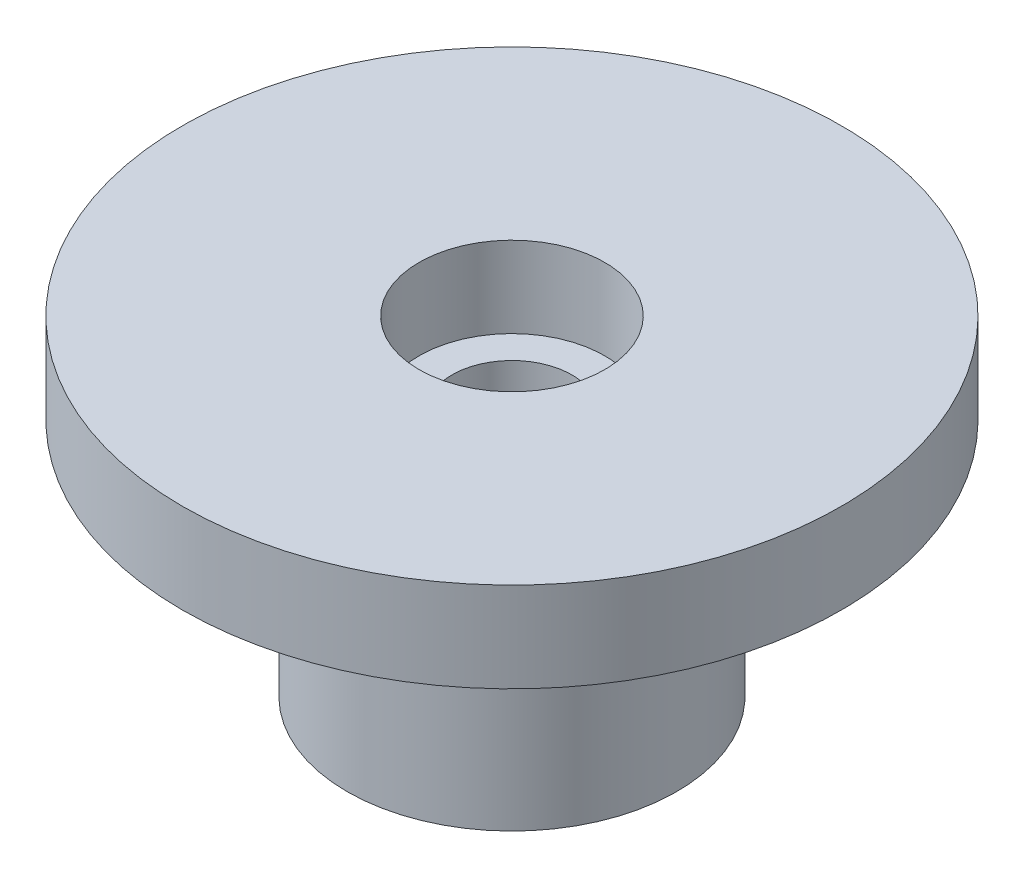
ISO-10303-21;
HEADER;
FILE_DESCRIPTION(('STEP AP214'),'2;1');
FILE_NAME('part.step','',(''),(''),'','','');
FILE_SCHEMA(('AUTOMOTIVE_DESIGN { 1 0 10303 214 1 1 1 1 }'));
ENDSEC;
DATA;
#1=APPLICATION_CONTEXT('core data for automotive mechanical design processes');
#2=APPLICATION_PROTOCOL_DEFINITION('international standard','automotive_design',2000,#1);
#3=PRODUCT_CONTEXT('',#1,'mechanical');
#4=PRODUCT('Part','Part','',(#3));
#5=PRODUCT_RELATED_PRODUCT_CATEGORY('part','',(#4));
#6=PRODUCT_DEFINITION_FORMATION('','',#4);
#7=PRODUCT_DEFINITION_CONTEXT('part definition',#1,'design');
#8=PRODUCT_DEFINITION('design','',#6,#7);
#9=PRODUCT_DEFINITION_SHAPE('','',#8);
#10=(LENGTH_UNIT() NAMED_UNIT(*) SI_UNIT(.MILLI.,.METRE.));
#11=(NAMED_UNIT(*) PLANE_ANGLE_UNIT() SI_UNIT($,.RADIAN.));
#12=(NAMED_UNIT(*) SI_UNIT($,.STERADIAN.) SOLID_ANGLE_UNIT());
#13=UNCERTAINTY_MEASURE_WITH_UNIT(LENGTH_MEASURE(1.E-05),#10,'distance_accuracy_value','');
#14=(GEOMETRIC_REPRESENTATION_CONTEXT(3) GLOBAL_UNCERTAINTY_ASSIGNED_CONTEXT((#13)) GLOBAL_UNIT_ASSIGNED_CONTEXT((#10,
#11,#12)) REPRESENTATION_CONTEXT('',''));
#15=CARTESIAN_POINT('',(0.,0.,0.));
#16=DIRECTION('',(0.,0.,1.));
#17=DIRECTION('',(1.,0.,0.));
#18=AXIS2_PLACEMENT_3D('',#15,#16,#17);
#19=CARTESIAN_POINT('',(0.,-11.,0.));
#20=DIRECTION('',(0.,1.,0.));
#21=DIRECTION('',(0.,0.,1.));
#22=AXIS2_PLACEMENT_3D('',#19,#20,#21);
#23=CYLINDRICAL_SURFACE('',#22,2.);
#24=CARTESIAN_POINT('',(0.,0.,0.));
#25=DIRECTION('',(0.,1.,0.));
#26=DIRECTION('',(0.,0.,1.));
#27=AXIS2_PLACEMENT_3D('',#24,#25,#26);
#28=CIRCLE('',#27,2.);
#29=CARTESIAN_POINT('',(0.,0.,2.));
#30=VERTEX_POINT('',#29);
#31=EDGE_CURVE('E63',#30,#30,#28,.F.);
#32=ORIENTED_EDGE('',*,*,#31,.T.);
#33=EDGE_LOOP('',(#32));
#34=FACE_BOUND('',#33,.T.);
#35=CARTESIAN_POINT('',(0.,8.3,0.));
#36=DIRECTION('',(0.,1.,0.));
#37=DIRECTION('',(0.,0.,1.));
#38=AXIS2_PLACEMENT_3D('',#35,#36,#37);
#39=CIRCLE('',#38,2.);
#40=CARTESIAN_POINT('',(0.,8.3,2.));
#41=VERTEX_POINT('',#40);
#42=EDGE_CURVE('E51',#41,#41,#39,.F.);
#43=ORIENTED_EDGE('',*,*,#42,.F.);
#44=EDGE_LOOP('',(#43));
#45=FACE_BOUND('',#44,.T.);
#46=ADVANCED_FACE('F35',(#34,#45),#23,.F.);
#47=CARTESIAN_POINT('',(0.,11.,0.));
#48=DIRECTION('',(0.,-1.,0.));
#49=DIRECTION('',(0.,0.,-1.));
#50=AXIS2_PLACEMENT_3D('',#47,#48,#49);
#51=CYLINDRICAL_SURFACE('',#50,11.);
#52=CARTESIAN_POINT('',(0.,8.,0.));
#53=DIRECTION('',(0.,1.,0.));
#54=DIRECTION('',(0.,0.,1.));
#55=AXIS2_PLACEMENT_3D('',#52,#53,#54);
#56=CIRCLE('',#55,11.);
#57=CARTESIAN_POINT('',(0.,8.,11.));
#58=VERTEX_POINT('',#57);
#59=EDGE_CURVE('E43',#58,#58,#56,.T.);
#60=ORIENTED_EDGE('',*,*,#59,.T.);
#61=EDGE_LOOP('',(#60));
#62=FACE_BOUND('',#61,.T.);
#63=CARTESIAN_POINT('',(0.,11.,0.));
#64=DIRECTION('',(0.,1.,0.));
#65=DIRECTION('',(0.,0.,1.));
#66=AXIS2_PLACEMENT_3D('',#63,#64,#65);
#67=CIRCLE('',#66,11.);
#68=CARTESIAN_POINT('',(0.,11.,11.));
#69=VERTEX_POINT('',#68);
#70=EDGE_CURVE('E10',#69,#69,#67,.T.);
#71=ORIENTED_EDGE('',*,*,#70,.F.);
#72=EDGE_LOOP('',(#71));
#73=FACE_BOUND('',#72,.T.);
#74=ADVANCED_FACE('F37',(#62,#73),#51,.T.);
#75=CARTESIAN_POINT('',(0.,11.,0.));
#76=DIRECTION('',(0.,1.,0.));
#77=DIRECTION('',(0.,0.,1.));
#78=AXIS2_PLACEMENT_3D('',#75,#76,#77);
#79=PLANE('',#78);
#80=CARTESIAN_POINT('',(0.,11.,0.));
#81=DIRECTION('',(0.,1.,0.));
#82=DIRECTION('',(0.,0.,1.));
#83=AXIS2_PLACEMENT_3D('',#80,#81,#82);
#84=CIRCLE('',#83,3.1);
#85=CARTESIAN_POINT('',(0.,11.,3.1));
#86=VERTEX_POINT('',#85);
#87=EDGE_CURVE('E58',#86,#86,#84,.T.);
#88=ORIENTED_EDGE('',*,*,#87,.F.);
#89=EDGE_LOOP('',(#88));
#90=FACE_BOUND('',#89,.T.);
#91=ORIENTED_EDGE('',*,*,#70,.T.);
#92=EDGE_LOOP('',(#91));
#93=FACE_BOUND('',#92,.T.);
#94=ADVANCED_FACE('F92',(#90,#93),#79,.T.);
#95=CARTESIAN_POINT('',(0.,8.,0.));
#96=DIRECTION('',(0.,1.,0.));
#97=DIRECTION('',(0.,0.,1.));
#98=AXIS2_PLACEMENT_3D('',#95,#96,#97);
#99=PLANE('',#98);
#100=ORIENTED_EDGE('',*,*,#59,.F.);
#101=EDGE_LOOP('',(#100));
#102=FACE_BOUND('',#101,.T.);
#103=CARTESIAN_POINT('',(0.,8.,0.));
#104=DIRECTION('',(0.,1.,0.));
#105=DIRECTION('',(0.,0.,1.));
#106=AXIS2_PLACEMENT_3D('',#103,#104,#105);
#107=CIRCLE('',#106,5.5);
#108=CARTESIAN_POINT('',(0.,8.,5.5));
#109=VERTEX_POINT('',#108);
#110=EDGE_CURVE('E48',#109,#109,#107,.T.);
#111=ORIENTED_EDGE('',*,*,#110,.T.);
#112=EDGE_LOOP('',(#111));
#113=FACE_BOUND('',#112,.T.);
#114=ADVANCED_FACE('F98',(#102,#113),#99,.F.);
#115=CARTESIAN_POINT('',(0.,8.,0.));
#116=DIRECTION('',(0.,-1.,0.));
#117=DIRECTION('',(0.,0.,-1.));
#118=AXIS2_PLACEMENT_3D('',#115,#116,#117);
#119=CYLINDRICAL_SURFACE('',#118,5.5);
#120=CARTESIAN_POINT('',(0.,0.,0.));
#121=DIRECTION('',(0.,1.,0.));
#122=DIRECTION('',(0.,0.,1.));
#123=AXIS2_PLACEMENT_3D('',#120,#121,#122);
#124=CIRCLE('',#123,5.5);
#125=CARTESIAN_POINT('',(0.,0.,5.5));
#126=VERTEX_POINT('',#125);
#127=EDGE_CURVE('E39',#126,#126,#124,.T.);
#128=ORIENTED_EDGE('',*,*,#127,.T.);
#129=EDGE_LOOP('',(#128));
#130=FACE_BOUND('',#129,.T.);
#131=ORIENTED_EDGE('',*,*,#110,.F.);
#132=EDGE_LOOP('',(#131));
#133=FACE_BOUND('',#132,.T.);
#134=ADVANCED_FACE('F72',(#130,#133),#119,.T.);
#135=CARTESIAN_POINT('',(0.,8.3,0.));
#136=DIRECTION('',(0.,1.,0.));
#137=DIRECTION('',(0.,0.,1.));
#138=AXIS2_PLACEMENT_3D('',#135,#136,#137);
#139=PLANE('',#138);
#140=CARTESIAN_POINT('',(0.,8.3,0.));
#141=DIRECTION('',(0.,1.,0.));
#142=DIRECTION('',(0.,0.,1.));
#143=AXIS2_PLACEMENT_3D('',#140,#141,#142);
#144=CIRCLE('',#143,3.1);
#145=CARTESIAN_POINT('',(0.,8.3,3.1));
#146=VERTEX_POINT('',#145);
#147=EDGE_CURVE('E53',#146,#146,#144,.T.);
#148=ORIENTED_EDGE('',*,*,#147,.T.);
#149=EDGE_LOOP('',(#148));
#150=FACE_BOUND('',#149,.T.);
#151=ORIENTED_EDGE('',*,*,#42,.T.);
#152=EDGE_LOOP('',(#151));
#153=FACE_BOUND('',#152,.T.);
#154=ADVANCED_FACE('F83',(#150,#153),#139,.T.);
#155=CARTESIAN_POINT('',(0.,8.3,0.));
#156=DIRECTION('',(0.,1.,0.));
#157=DIRECTION('',(0.,0.,1.));
#158=AXIS2_PLACEMENT_3D('',#155,#156,#157);
#159=CYLINDRICAL_SURFACE('',#158,3.1);
#160=CARTESIAN_POINT('',(0.,8.3,3.1));
#161=CARTESIAN_POINT('',(0.,8.328125,3.1));
#162=CARTESIAN_POINT('',(0.,8.35625,3.1));
#163=CARTESIAN_POINT('',(0.,8.4125,3.1));
#164=CARTESIAN_POINT('',(0.,8.440625,3.1));
#165=CARTESIAN_POINT('',(0.,8.496875,3.1));
#166=CARTESIAN_POINT('',(0.,8.525,3.1));
#167=CARTESIAN_POINT('',(0.,8.58125,3.1));
#168=CARTESIAN_POINT('',(0.,8.609375,3.1));
#169=CARTESIAN_POINT('',(0.,8.665625,3.1));
#170=CARTESIAN_POINT('',(0.,8.69375,3.1));
#171=CARTESIAN_POINT('',(0.,8.75,3.1));
#172=CARTESIAN_POINT('',(0.,8.778125,3.1));
#173=CARTESIAN_POINT('',(0.,8.834375,3.1));
#174=CARTESIAN_POINT('',(0.,8.8625,3.1));
#175=CARTESIAN_POINT('',(0.,8.91875,3.1));
#176=CARTESIAN_POINT('',(0.,8.946875,3.1));
#177=CARTESIAN_POINT('',(0.,9.003125,3.1));
#178=CARTESIAN_POINT('',(0.,9.03125,3.1));
#179=CARTESIAN_POINT('',(0.,9.0875,3.1));
#180=CARTESIAN_POINT('',(0.,9.115625,3.1));
#181=CARTESIAN_POINT('',(0.,9.171875,3.1));
#182=CARTESIAN_POINT('',(0.,9.2,3.1));
#183=CARTESIAN_POINT('',(0.,9.25625,3.1));
#184=CARTESIAN_POINT('',(0.,9.284375,3.1));
#185=CARTESIAN_POINT('',(0.,9.340625,3.1));
#186=CARTESIAN_POINT('',(0.,9.36875,3.1));
#187=CARTESIAN_POINT('',(0.,9.425,3.1));
#188=CARTESIAN_POINT('',(0.,9.453125,3.1));
#189=CARTESIAN_POINT('',(0.,9.509375,3.1));
#190=CARTESIAN_POINT('',(0.,9.5375,3.1));
#191=CARTESIAN_POINT('',(0.,9.59375,3.1));
#192=CARTESIAN_POINT('',(0.,9.621875,3.1));
#193=CARTESIAN_POINT('',(0.,9.678125,3.1));
#194=CARTESIAN_POINT('',(0.,9.70625,3.1));
#195=CARTESIAN_POINT('',(0.,9.7625,3.1));
#196=CARTESIAN_POINT('',(0.,9.790625,3.1));
#197=CARTESIAN_POINT('',(0.,9.846875,3.1));
#198=CARTESIAN_POINT('',(0.,9.875,3.1));
#199=CARTESIAN_POINT('',(0.,9.93125,3.1));
#200=CARTESIAN_POINT('',(0.,9.959375,3.1));
#201=CARTESIAN_POINT('',(0.,10.015625,3.1));
#202=CARTESIAN_POINT('',(0.,10.04375,3.1));
#203=CARTESIAN_POINT('',(0.,10.1,3.1));
#204=CARTESIAN_POINT('',(0.,10.128125,3.1));
#205=CARTESIAN_POINT('',(0.,10.184375,3.1));
#206=CARTESIAN_POINT('',(0.,10.2125,3.1));
#207=CARTESIAN_POINT('',(0.,10.26875,3.1));
#208=CARTESIAN_POINT('',(0.,10.296875,3.1));
#209=CARTESIAN_POINT('',(0.,10.353125,3.1));
#210=CARTESIAN_POINT('',(0.,10.38125,3.1));
#211=CARTESIAN_POINT('',(0.,10.4375,3.1));
#212=CARTESIAN_POINT('',(0.,10.465625,3.1));
#213=CARTESIAN_POINT('',(0.,10.521875,3.1));
#214=CARTESIAN_POINT('',(0.,10.55,3.1));
#215=CARTESIAN_POINT('',(0.,10.60625,3.1));
#216=CARTESIAN_POINT('',(0.,10.634375,3.1));
#217=CARTESIAN_POINT('',(0.,10.690625,3.1));
#218=CARTESIAN_POINT('',(0.,10.71875,3.1));
#219=CARTESIAN_POINT('',(0.,10.775,3.1));
#220=CARTESIAN_POINT('',(0.,10.803125,3.1));
#221=CARTESIAN_POINT('',(0.,10.859375,3.1));
#222=CARTESIAN_POINT('',(0.,10.8875,3.1));
#223=CARTESIAN_POINT('',(0.,10.94375,3.1));
#224=CARTESIAN_POINT('',(0.,10.971875,3.1));
#225=CARTESIAN_POINT('',(0.,11.,3.1));
#226=B_SPLINE_CURVE_WITH_KNOTS('',3,(#160,#161,#162,#163,#164,#165,#166,#167,#168,#169,#170,
#171,#172,#173,#174,#175,#176,#177,#178,#179,#180,#181,#182,#183,#184,#185,#186,#187,#188,#189,
#190,#191,#192,#193,#194,#195,#196,#197,#198,#199,#200,#201,#202,#203,#204,#205,#206,#207,#208,
#209,#210,#211,#212,#213,#214,#215,#216,#217,#218,#219,#220,#221,#222,#223,#224,#225),
.UNSPECIFIED.,.F.,.F.,(4,2,2,2,2,2,2,2,2,2,2,2,2,2,2,2,2,2,2,2,2,2,2,2,2,2,2,2,2,2,2,2,4),(0.,
0.0843750000000011,0.168750000000001,0.253125000000002,0.337500000000001,0.421875,
0.506250000000002,0.590625000000001,0.675,0.759375000000001,0.843750000000001,0.928125000000002,
1.0125,1.096875,1.18125,1.265625,1.35,1.434375,1.51875,1.603125,1.6875,1.771875,1.85625,
1.940625,2.025,2.109375,2.19375,2.278125,2.3625,2.446875,2.53125,2.615625,2.7),.UNSPECIFIED.);
#227=EDGE_CURVE('BSEAM78',#146,#86,#226,.T.);
#228=ORIENTED_EDGE('',*,*,#147,.F.);
#229=ORIENTED_EDGE('',*,*,#87,.T.);
#230=ORIENTED_EDGE('',*,*,#227,.T.);
#231=ORIENTED_EDGE('',*,*,#227,.F.);
#232=EDGE_LOOP('',(#228,#230,#229,#231));
#233=FACE_BOUND('',#232,.T.);
#234=ADVANCED_FACE('F78',(#233),#159,.F.);
#235=CARTESIAN_POINT('',(0.,0.,0.));
#236=DIRECTION('',(0.,1.,0.));
#237=DIRECTION('',(0.,0.,1.));
#238=AXIS2_PLACEMENT_3D('',#235,#236,#237);
#239=PLANE('',#238);
#240=ORIENTED_EDGE('',*,*,#127,.F.);
#241=EDGE_LOOP('',(#240));
#242=FACE_BOUND('',#241,.T.);
#243=ORIENTED_EDGE('',*,*,#31,.F.);
#244=EDGE_LOOP('',(#243));
#245=FACE_BOUND('',#244,.T.);
#246=ADVANCED_FACE('F75',(#242,#245),#239,.F.);
#247=CLOSED_SHELL('',(#46,#74,#94,#114,#134,#154,#234,#246));
#248=MANIFOLD_SOLID_BREP('B2',#247);
#249=ADVANCED_BREP_SHAPE_REPRESENTATION('',(#18,#248),#14);
#250=SHAPE_DEFINITION_REPRESENTATION(#9,#249);
ENDSEC;
END-ISO-10303-21;
